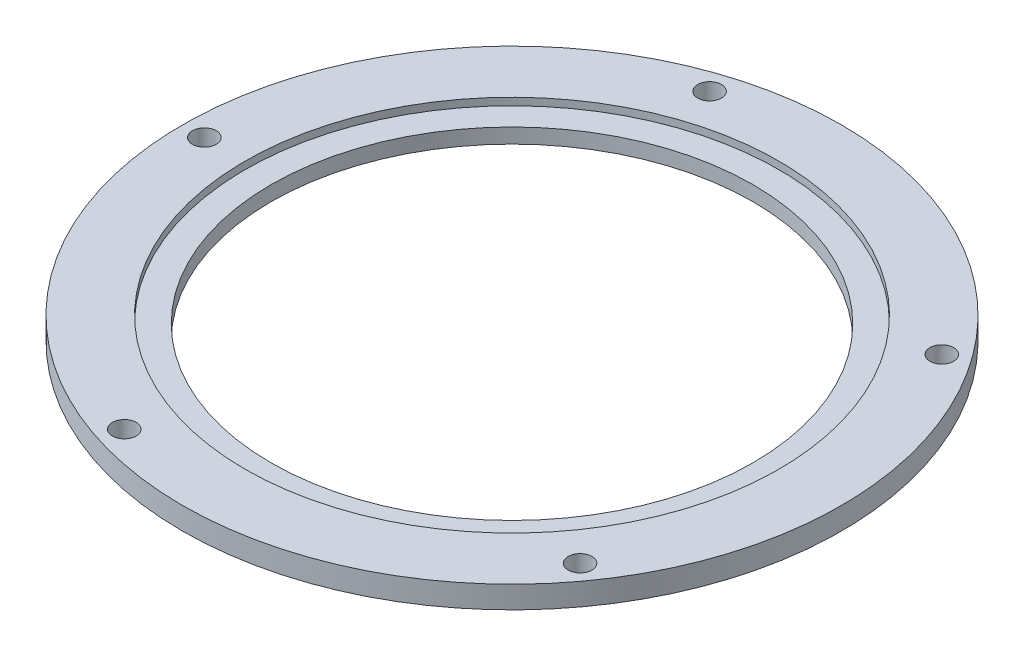
ISO-10303-21;
HEADER;
FILE_DESCRIPTION(('STEP AP214'),'2;1');
FILE_NAME('part.step','',(''),(''),'','','');
FILE_SCHEMA(('AUTOMOTIVE_DESIGN { 1 0 10303 214 1 1 1 1 }'));
ENDSEC;
DATA;
#1=APPLICATION_CONTEXT('core data for automotive mechanical design processes');
#2=APPLICATION_PROTOCOL_DEFINITION('international standard','automotive_design',2000,#1);
#3=PRODUCT_CONTEXT('',#1,'mechanical');
#4=PRODUCT('Part','Part','',(#3));
#5=PRODUCT_RELATED_PRODUCT_CATEGORY('part','',(#4));
#6=PRODUCT_DEFINITION_FORMATION('','',#4);
#7=PRODUCT_DEFINITION_CONTEXT('part definition',#1,'design');
#8=PRODUCT_DEFINITION('design','',#6,#7);
#9=PRODUCT_DEFINITION_SHAPE('','',#8);
#10=(LENGTH_UNIT() NAMED_UNIT(*) SI_UNIT(.MILLI.,.METRE.));
#11=(NAMED_UNIT(*) PLANE_ANGLE_UNIT() SI_UNIT($,.RADIAN.));
#12=(NAMED_UNIT(*) SI_UNIT($,.STERADIAN.) SOLID_ANGLE_UNIT());
#13=UNCERTAINTY_MEASURE_WITH_UNIT(LENGTH_MEASURE(1.E-05),#10,'distance_accuracy_value','');
#14=(GEOMETRIC_REPRESENTATION_CONTEXT(3) GLOBAL_UNCERTAINTY_ASSIGNED_CONTEXT((#13)) GLOBAL_UNIT_ASSIGNED_CONTEXT((#10,
#11,#12)) REPRESENTATION_CONTEXT('',''));
#15=CARTESIAN_POINT('',(0.,0.,0.));
#16=DIRECTION('',(0.,0.,1.));
#17=DIRECTION('',(1.,0.,0.));
#18=AXIS2_PLACEMENT_3D('',#15,#16,#17);
#19=CARTESIAN_POINT('',(0.,3.,0.));
#20=DIRECTION('',(0.,-1.,0.));
#21=DIRECTION('',(0.,0.,-1.));
#22=AXIS2_PLACEMENT_3D('',#19,#20,#21);
#23=CYLINDRICAL_SURFACE('',#22,36.);
#24=CARTESIAN_POINT('',(0.,2.,0.));
#25=DIRECTION('',(0.,1.,0.));
#26=DIRECTION('',(0.,0.,1.));
#27=AXIS2_PLACEMENT_3D('',#24,#25,#26);
#28=CIRCLE('',#27,36.);
#29=CARTESIAN_POINT('',(0.,2.,36.));
#30=VERTEX_POINT('',#29);
#31=EDGE_CURVE('E10',#30,#30,#28,.T.);
#32=ORIENTED_EDGE('',*,*,#31,.F.);
#33=EDGE_LOOP('',(#32));
#34=FACE_BOUND('',#33,.T.);
#35=CARTESIAN_POINT('',(0.,3.,0.));
#36=DIRECTION('',(0.,1.,0.));
#37=DIRECTION('',(0.,0.,1.));
#38=AXIS2_PLACEMENT_3D('',#35,#36,#37);
#39=CIRCLE('',#38,36.);
#40=CARTESIAN_POINT('',(0.,3.,36.));
#41=VERTEX_POINT('',#40);
#42=EDGE_CURVE('E49',#41,#41,#39,.T.);
#43=ORIENTED_EDGE('',*,*,#42,.T.);
#44=EDGE_LOOP('',(#43));
#45=FACE_BOUND('',#44,.T.);
#46=ADVANCED_FACE('F39',(#34,#45),#23,.F.);
#47=CARTESIAN_POINT('',(0.,3.,0.));
#48=DIRECTION('',(0.,-1.,0.));
#49=DIRECTION('',(0.,0.,-1.));
#50=AXIS2_PLACEMENT_3D('',#47,#48,#49);
#51=CYLINDRICAL_SURFACE('',#50,44.45);
#52=CARTESIAN_POINT('',(0.,3.,0.));
#53=DIRECTION('',(0.,1.,0.));
#54=DIRECTION('',(0.,0.,1.));
#55=AXIS2_PLACEMENT_3D('',#52,#53,#54);
#56=CIRCLE('',#55,44.45);
#57=CARTESIAN_POINT('',(0.,3.,44.45));
#58=VERTEX_POINT('',#57);
#59=EDGE_CURVE('E45',#58,#58,#56,.T.);
#60=ORIENTED_EDGE('',*,*,#59,.F.);
#61=EDGE_LOOP('',(#60));
#62=FACE_BOUND('',#61,.T.);
#63=CARTESIAN_POINT('',(0.,0.,0.));
#64=DIRECTION('',(0.,1.,0.));
#65=DIRECTION('',(0.,0.,1.));
#66=AXIS2_PLACEMENT_3D('',#63,#64,#65);
#67=CIRCLE('',#66,44.45);
#68=CARTESIAN_POINT('',(0.,0.,44.45));
#69=VERTEX_POINT('',#68);
#70=EDGE_CURVE('E54',#69,#69,#67,.T.);
#71=ORIENTED_EDGE('',*,*,#70,.T.);
#72=EDGE_LOOP('',(#71));
#73=FACE_BOUND('',#72,.T.);
#74=ADVANCED_FACE('F105',(#62,#73),#51,.T.);
#75=CARTESIAN_POINT('',(0.,3.,0.));
#76=DIRECTION('',(0.,1.,0.));
#77=DIRECTION('',(0.,0.,1.));
#78=AXIS2_PLACEMENT_3D('',#75,#76,#77);
#79=PLANE('',#78);
#80=CARTESIAN_POINT('',(-12.8242052665608,3.,-39.4688454262487));
#81=DIRECTION('',(0.,1.,0.));
#82=DIRECTION('',(0.,0.,1.));
#83=AXIS2_PLACEMENT_3D('',#80,#81,#82);
#84=CIRCLE('',#83,1.59999999999999);
#85=CARTESIAN_POINT('',(-12.8242052665608,3.,-37.8688454262487));
#86=VERTEX_POINT('',#85);
#87=EDGE_CURVE('E95',#86,#86,#84,.T.);
#88=ORIENTED_EDGE('',*,*,#87,.F.);
#89=EDGE_LOOP('',(#88));
#90=FACE_BOUND('',#89,.T.);
#91=CARTESIAN_POINT('',(33.5742052665601,3.,-24.3930879701379));
#92=DIRECTION('',(0.,1.,0.));
#93=DIRECTION('',(0.,0.,1.));
#94=AXIS2_PLACEMENT_3D('',#91,#92,#93);
#95=CIRCLE('',#94,1.59999999999999);
#96=CARTESIAN_POINT('',(33.5742052665601,3.,-22.7930879701379));
#97=VERTEX_POINT('',#96);
#98=EDGE_CURVE('E89',#97,#97,#95,.T.);
#99=ORIENTED_EDGE('',*,*,#98,.F.);
#100=EDGE_LOOP('',(#99));
#101=FACE_BOUND('',#100,.T.);
#102=CARTESIAN_POINT('',(33.5742052665605,3.,24.3930879701374));
#103=DIRECTION('',(0.,1.,0.));
#104=DIRECTION('',(0.,0.,1.));
#105=AXIS2_PLACEMENT_3D('',#102,#103,#104);
#106=CIRCLE('',#105,1.59999999999998);
#107=CARTESIAN_POINT('',(33.5742052665605,3.,25.9930879701374));
#108=VERTEX_POINT('',#107);
#109=EDGE_CURVE('E83',#108,#108,#106,.T.);
#110=ORIENTED_EDGE('',*,*,#109,.F.);
#111=EDGE_LOOP('',(#110));
#112=FACE_BOUND('',#111,.T.);
#113=CARTESIAN_POINT('',(-12.8242052665602,3.,39.4688454262489));
#114=DIRECTION('',(0.,1.,0.));
#115=DIRECTION('',(0.,0.,1.));
#116=AXIS2_PLACEMENT_3D('',#113,#114,#115);
#117=CIRCLE('',#116,1.59999999999999);
#118=CARTESIAN_POINT('',(-12.8242052665602,3.,41.0688454262489));
#119=VERTEX_POINT('',#118);
#120=EDGE_CURVE('E77',#119,#119,#117,.T.);
#121=ORIENTED_EDGE('',*,*,#120,.F.);
#122=EDGE_LOOP('',(#121));
#123=FACE_BOUND('',#122,.T.);
#124=CARTESIAN_POINT('',(-41.5,3.,0.));
#125=DIRECTION('',(0.,1.,0.));
#126=DIRECTION('',(0.,0.,1.));
#127=AXIS2_PLACEMENT_3D('',#124,#125,#126);
#128=CIRCLE('',#127,1.59999999999998);
#129=CARTESIAN_POINT('',(-41.5,3.,1.59999999999998));
#130=VERTEX_POINT('',#129);
#131=EDGE_CURVE('E71',#130,#130,#128,.T.);
#132=ORIENTED_EDGE('',*,*,#131,.F.);
#133=EDGE_LOOP('',(#132));
#134=FACE_BOUND('',#133,.T.);
#135=ORIENTED_EDGE('',*,*,#42,.F.);
#136=EDGE_LOOP('',(#135));
#137=FACE_BOUND('',#136,.T.);
#138=ORIENTED_EDGE('',*,*,#59,.T.);
#139=EDGE_LOOP('',(#138));
#140=FACE_BOUND('',#139,.T.);
#141=ADVANCED_FACE('F101',(#90,#101,#112,#123,#134,#137,#140),#79,.T.);
#142=CARTESIAN_POINT('',(0.,0.,0.));
#143=DIRECTION('',(0.,1.,0.));
#144=DIRECTION('',(0.,0.,1.));
#145=AXIS2_PLACEMENT_3D('',#142,#143,#144);
#146=PLANE('',#145);
#147=CARTESIAN_POINT('',(-12.8242052665608,0.,-39.4688454262487));
#148=DIRECTION('',(0.,1.,0.));
#149=DIRECTION('',(0.,0.,1.));
#150=AXIS2_PLACEMENT_3D('',#147,#148,#149);
#151=CIRCLE('',#150,1.6);
#152=CARTESIAN_POINT('',(-12.8242052665608,0.,-37.8688454262487));
#153=VERTEX_POINT('',#152);
#154=EDGE_CURVE('E92',#153,#153,#151,.T.);
#155=ORIENTED_EDGE('',*,*,#154,.T.);
#156=EDGE_LOOP('',(#155));
#157=FACE_BOUND('',#156,.T.);
#158=CARTESIAN_POINT('',(33.5742052665601,0.,-24.3930879701379));
#159=DIRECTION('',(0.,1.,0.));
#160=DIRECTION('',(0.,0.,1.));
#161=AXIS2_PLACEMENT_3D('',#158,#159,#160);
#162=CIRCLE('',#161,1.6);
#163=CARTESIAN_POINT('',(33.5742052665601,0.,-22.7930879701379));
#164=VERTEX_POINT('',#163);
#165=EDGE_CURVE('E86',#164,#164,#162,.T.);
#166=ORIENTED_EDGE('',*,*,#165,.T.);
#167=EDGE_LOOP('',(#166));
#168=FACE_BOUND('',#167,.T.);
#169=CARTESIAN_POINT('',(33.5742052665605,0.,24.3930879701374));
#170=DIRECTION('',(0.,1.,0.));
#171=DIRECTION('',(0.,0.,1.));
#172=AXIS2_PLACEMENT_3D('',#169,#170,#171);
#173=CIRCLE('',#172,1.6);
#174=CARTESIAN_POINT('',(33.5742052665605,0.,25.9930879701374));
#175=VERTEX_POINT('',#174);
#176=EDGE_CURVE('E80',#175,#175,#173,.T.);
#177=ORIENTED_EDGE('',*,*,#176,.T.);
#178=EDGE_LOOP('',(#177));
#179=FACE_BOUND('',#178,.T.);
#180=CARTESIAN_POINT('',(-12.8242052665602,0.,39.4688454262489));
#181=DIRECTION('',(0.,1.,0.));
#182=DIRECTION('',(0.,0.,1.));
#183=AXIS2_PLACEMENT_3D('',#180,#181,#182);
#184=CIRCLE('',#183,1.6);
#185=CARTESIAN_POINT('',(-12.8242052665602,0.,41.0688454262489));
#186=VERTEX_POINT('',#185);
#187=EDGE_CURVE('E74',#186,#186,#184,.T.);
#188=ORIENTED_EDGE('',*,*,#187,.T.);
#189=EDGE_LOOP('',(#188));
#190=FACE_BOUND('',#189,.T.);
#191=CARTESIAN_POINT('',(-41.5,0.,0.));
#192=DIRECTION('',(0.,1.,0.));
#193=DIRECTION('',(0.,0.,1.));
#194=AXIS2_PLACEMENT_3D('',#191,#192,#193);
#195=CIRCLE('',#194,1.6);
#196=CARTESIAN_POINT('',(-41.5,0.,1.6));
#197=VERTEX_POINT('',#196);
#198=EDGE_CURVE('E67',#197,#197,#195,.T.);
#199=ORIENTED_EDGE('',*,*,#198,.T.);
#200=EDGE_LOOP('',(#199));
#201=FACE_BOUND('',#200,.T.);
#202=ORIENTED_EDGE('',*,*,#70,.F.);
#203=EDGE_LOOP('',(#202));
#204=FACE_BOUND('',#203,.T.);
#205=CARTESIAN_POINT('',(0.,0.,0.));
#206=DIRECTION('',(0.,1.,0.));
#207=DIRECTION('',(0.,0.,1.));
#208=AXIS2_PLACEMENT_3D('',#205,#206,#207);
#209=CIRCLE('',#208,32.5);
#210=CARTESIAN_POINT('',(0.,0.,32.5));
#211=VERTEX_POINT('',#210);
#212=EDGE_CURVE('E62',#211,#211,#209,.T.);
#213=ORIENTED_EDGE('',*,*,#212,.T.);
#214=EDGE_LOOP('',(#213));
#215=FACE_BOUND('',#214,.T.);
#216=ADVANCED_FACE('F104',(#157,#168,#179,#190,#201,#204,#215),#146,.F.);
#217=CARTESIAN_POINT('',(0.,2.,0.));
#218=DIRECTION('',(0.,-1.,0.));
#219=DIRECTION('',(0.,0.,-1.));
#220=AXIS2_PLACEMENT_3D('',#217,#218,#219);
#221=CYLINDRICAL_SURFACE('',#220,32.5);
#222=CARTESIAN_POINT('',(0.,2.,0.));
#223=DIRECTION('',(0.,1.,0.));
#224=DIRECTION('',(0.,0.,1.));
#225=AXIS2_PLACEMENT_3D('',#222,#223,#224);
#226=CIRCLE('',#225,32.5);
#227=CARTESIAN_POINT('',(0.,2.,32.5));
#228=VERTEX_POINT('',#227);
#229=EDGE_CURVE('E58',#228,#228,#226,.T.);
#230=ORIENTED_EDGE('',*,*,#229,.T.);
#231=EDGE_LOOP('',(#230));
#232=FACE_BOUND('',#231,.T.);
#233=ORIENTED_EDGE('',*,*,#212,.F.);
#234=EDGE_LOOP('',(#233));
#235=FACE_BOUND('',#234,.T.);
#236=ADVANCED_FACE('F128',(#232,#235),#221,.F.);
#237=CARTESIAN_POINT('',(0.,2.,0.));
#238=DIRECTION('',(0.,1.,0.));
#239=DIRECTION('',(0.,0.,1.));
#240=AXIS2_PLACEMENT_3D('',#237,#238,#239);
#241=PLANE('',#240);
#242=ORIENTED_EDGE('',*,*,#229,.F.);
#243=EDGE_LOOP('',(#242));
#244=FACE_BOUND('',#243,.T.);
#245=ORIENTED_EDGE('',*,*,#31,.T.);
#246=EDGE_LOOP('',(#245));
#247=FACE_BOUND('',#246,.T.);
#248=ADVANCED_FACE('F132',(#244,#247),#241,.T.);
#249=CARTESIAN_POINT('',(-41.5,3.,0.));
#250=DIRECTION('',(0.,1.,0.));
#251=DIRECTION('',(0.,0.,1.));
#252=AXIS2_PLACEMENT_3D('',#249,#250,#251);
#253=CYLINDRICAL_SURFACE('',#252,1.59999999999999);
#254=ORIENTED_EDGE('',*,*,#198,.F.);
#255=EDGE_LOOP('',(#254));
#256=FACE_BOUND('',#255,.T.);
#257=ORIENTED_EDGE('',*,*,#131,.T.);
#258=EDGE_LOOP('',(#257));
#259=FACE_BOUND('',#258,.T.);
#260=ADVANCED_FACE('F135',(#256,#259),#253,.F.);
#261=CARTESIAN_POINT('',(-12.8242052665602,3.,39.4688454262489));
#262=DIRECTION('',(0.,1.,0.));
#263=DIRECTION('',(0.,0.,1.));
#264=AXIS2_PLACEMENT_3D('',#261,#262,#263);
#265=CYLINDRICAL_SURFACE('',#264,1.59999999999999);
#266=ORIENTED_EDGE('',*,*,#187,.F.);
#267=EDGE_LOOP('',(#266));
#268=FACE_BOUND('',#267,.T.);
#269=ORIENTED_EDGE('',*,*,#120,.T.);
#270=EDGE_LOOP('',(#269));
#271=FACE_BOUND('',#270,.T.);
#272=ADVANCED_FACE('F139',(#268,#271),#265,.F.);
#273=CARTESIAN_POINT('',(33.5742052665605,3.,24.3930879701374));
#274=DIRECTION('',(0.,1.,0.));
#275=DIRECTION('',(0.,0.,1.));
#276=AXIS2_PLACEMENT_3D('',#273,#274,#275);
#277=CYLINDRICAL_SURFACE('',#276,1.59999999999999);
#278=ORIENTED_EDGE('',*,*,#176,.F.);
#279=EDGE_LOOP('',(#278));
#280=FACE_BOUND('',#279,.T.);
#281=ORIENTED_EDGE('',*,*,#109,.T.);
#282=EDGE_LOOP('',(#281));
#283=FACE_BOUND('',#282,.T.);
#284=ADVANCED_FACE('F143',(#280,#283),#277,.F.);
#285=CARTESIAN_POINT('',(33.5742052665601,3.,-24.3930879701379));
#286=DIRECTION('',(0.,1.,0.));
#287=DIRECTION('',(0.,0.,1.));
#288=AXIS2_PLACEMENT_3D('',#285,#286,#287);
#289=CYLINDRICAL_SURFACE('',#288,1.59999999999999);
#290=ORIENTED_EDGE('',*,*,#165,.F.);
#291=EDGE_LOOP('',(#290));
#292=FACE_BOUND('',#291,.T.);
#293=ORIENTED_EDGE('',*,*,#98,.T.);
#294=EDGE_LOOP('',(#293));
#295=FACE_BOUND('',#294,.T.);
#296=ADVANCED_FACE('F147',(#292,#295),#289,.F.);
#297=CARTESIAN_POINT('',(-12.8242052665608,3.,-39.4688454262487));
#298=DIRECTION('',(0.,1.,0.));
#299=DIRECTION('',(0.,0.,1.));
#300=AXIS2_PLACEMENT_3D('',#297,#298,#299);
#301=CYLINDRICAL_SURFACE('',#300,1.59999999999999);
#302=ORIENTED_EDGE('',*,*,#154,.F.);
#303=EDGE_LOOP('',(#302));
#304=FACE_BOUND('',#303,.T.);
#305=ORIENTED_EDGE('',*,*,#87,.T.);
#306=EDGE_LOOP('',(#305));
#307=FACE_BOUND('',#306,.T.);
#308=ADVANCED_FACE('F99',(#304,#307),#301,.F.);
#309=CLOSED_SHELL('',(#46,#74,#141,#216,#236,#248,#260,#272,#284,#296,#308));
#310=MANIFOLD_SOLID_BREP('B2',#309);
#311=ADVANCED_BREP_SHAPE_REPRESENTATION('',(#18,#310),#14);
#312=SHAPE_DEFINITION_REPRESENTATION(#9,#311);
ENDSEC;
END-ISO-10303-21;
